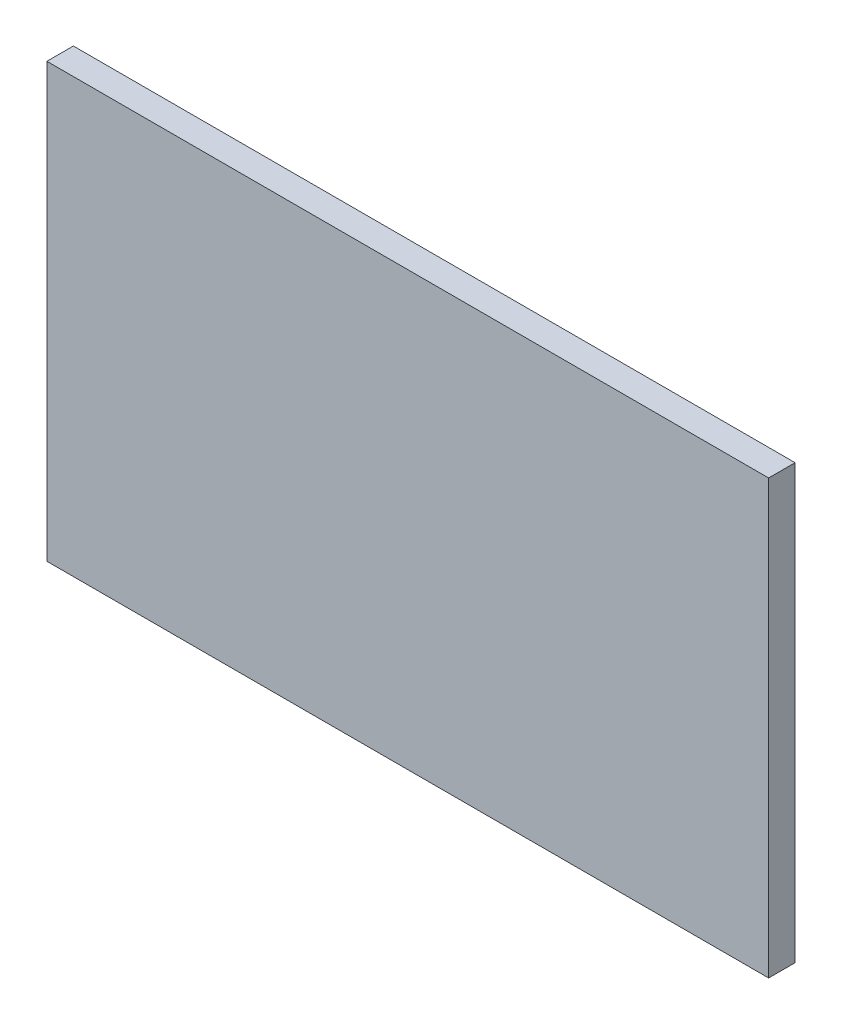
ISO-10303-21;
HEADER;
FILE_DESCRIPTION(('STEP AP214'),'2;1');
FILE_NAME('part.step','',(''),(''),'','','');
FILE_SCHEMA(('AUTOMOTIVE_DESIGN { 1 0 10303 214 1 1 1 1 }'));
ENDSEC;
DATA;
#1=APPLICATION_CONTEXT('core data for automotive mechanical design processes');
#2=APPLICATION_PROTOCOL_DEFINITION('international standard','automotive_design',2000,#1);
#3=PRODUCT_CONTEXT('',#1,'mechanical');
#4=PRODUCT('Part','Part','',(#3));
#5=PRODUCT_RELATED_PRODUCT_CATEGORY('part','',(#4));
#6=PRODUCT_DEFINITION_FORMATION('','',#4);
#7=PRODUCT_DEFINITION_CONTEXT('part definition',#1,'design');
#8=PRODUCT_DEFINITION('design','',#6,#7);
#9=PRODUCT_DEFINITION_SHAPE('','',#8);
#10=(LENGTH_UNIT() NAMED_UNIT(*) SI_UNIT(.MILLI.,.METRE.));
#11=(NAMED_UNIT(*) PLANE_ANGLE_UNIT() SI_UNIT($,.RADIAN.));
#12=(NAMED_UNIT(*) SI_UNIT($,.STERADIAN.) SOLID_ANGLE_UNIT());
#13=UNCERTAINTY_MEASURE_WITH_UNIT(LENGTH_MEASURE(1.E-05),#10,'distance_accuracy_value','');
#14=(GEOMETRIC_REPRESENTATION_CONTEXT(3) GLOBAL_UNCERTAINTY_ASSIGNED_CONTEXT((#13)) GLOBAL_UNIT_ASSIGNED_CONTEXT((#10,
#11,#12)) REPRESENTATION_CONTEXT('',''));
#15=CARTESIAN_POINT('',(0.,0.,0.));
#16=DIRECTION('',(0.,0.,1.));
#17=DIRECTION('',(1.,0.,0.));
#18=AXIS2_PLACEMENT_3D('',#15,#16,#17);
#19=CARTESIAN_POINT('',(0.,0.,0.));
#20=DIRECTION('',(1.,0.,0.));
#21=DIRECTION('',(0.,1.,0.));
#22=AXIS2_PLACEMENT_3D('',#19,#20,#21);
#23=PLANE('',#22);
#24=DIRECTION('',(0.,1.,0.));
#25=VECTOR('',#24,1.);
#26=CARTESIAN_POINT('',(0.,0.,0.055));
#27=LINE('',#26,#25);
#28=CARTESIAN_POINT('',(0.,0.,0.055));
#29=VERTEX_POINT('',#28);
#30=CARTESIAN_POINT('',(0.,0.9,0.055));
#31=VERTEX_POINT('',#30);
#32=EDGE_CURVE('E11',#29,#31,#27,.T.);
#33=ORIENTED_EDGE('',*,*,#32,.T.);
#34=DIRECTION('',(0.,0.,1.));
#35=VECTOR('',#34,1.);
#36=CARTESIAN_POINT('',(0.,0.9,0.));
#37=LINE('',#36,#35);
#38=CARTESIAN_POINT('',(0.,0.9,0.));
#39=VERTEX_POINT('',#38);
#40=EDGE_CURVE('E21',#39,#31,#37,.T.);
#41=ORIENTED_EDGE('',*,*,#40,.F.);
#42=DIRECTION('',(0.,1.,0.));
#43=VECTOR('',#42,1.);
#44=CARTESIAN_POINT('',(0.,0.,0.));
#45=LINE('',#44,#43);
#46=CARTESIAN_POINT('',(0.,0.,0.));
#47=VERTEX_POINT('',#46);
#48=EDGE_CURVE('E98',#47,#39,#45,.T.);
#49=ORIENTED_EDGE('',*,*,#48,.F.);
#50=DIRECTION('',(0.,0.,1.));
#51=VECTOR('',#50,1.);
#52=CARTESIAN_POINT('',(0.,0.,0.));
#53=LINE('',#52,#51);
#54=EDGE_CURVE('E28',#47,#29,#53,.T.);
#55=ORIENTED_EDGE('',*,*,#54,.T.);
#56=EDGE_LOOP('',(#33,#41,#49,#55));
#57=FACE_BOUND('',#56,.T.);
#58=ADVANCED_FACE('F17',(#57),#23,.F.);
#59=CARTESIAN_POINT('',(1.5,0.,0.));
#60=DIRECTION('',(1.,0.,0.));
#61=DIRECTION('',(0.,1.,0.));
#62=AXIS2_PLACEMENT_3D('',#59,#60,#61);
#63=PLANE('',#62);
#64=DIRECTION('',(0.,0.,1.));
#65=VECTOR('',#64,1.);
#66=CARTESIAN_POINT('',(1.5,0.,0.));
#67=LINE('',#66,#65);
#68=CARTESIAN_POINT('',(1.5,0.,0.));
#69=VERTEX_POINT('',#68);
#70=CARTESIAN_POINT('',(1.5,0.,0.055));
#71=VERTEX_POINT('',#70);
#72=EDGE_CURVE('E68',#69,#71,#67,.T.);
#73=ORIENTED_EDGE('',*,*,#72,.F.);
#74=DIRECTION('',(0.,1.,0.));
#75=VECTOR('',#74,1.);
#76=CARTESIAN_POINT('',(1.5,0.,0.));
#77=LINE('',#76,#75);
#78=CARTESIAN_POINT('',(1.5,0.9,0.));
#79=VERTEX_POINT('',#78);
#80=EDGE_CURVE('E71',#69,#79,#77,.T.);
#81=ORIENTED_EDGE('',*,*,#80,.T.);
#82=DIRECTION('',(0.,0.,1.));
#83=VECTOR('',#82,1.);
#84=CARTESIAN_POINT('',(1.5,0.9,0.));
#85=LINE('',#84,#83);
#86=CARTESIAN_POINT('',(1.5,0.9,0.055));
#87=VERTEX_POINT('',#86);
#88=EDGE_CURVE('E80',#79,#87,#85,.T.);
#89=ORIENTED_EDGE('',*,*,#88,.T.);
#90=DIRECTION('',(0.,1.,0.));
#91=VECTOR('',#90,1.);
#92=CARTESIAN_POINT('',(1.5,0.,0.055));
#93=LINE('',#92,#91);
#94=EDGE_CURVE('E74',#71,#87,#93,.T.);
#95=ORIENTED_EDGE('',*,*,#94,.F.);
#96=EDGE_LOOP('',(#73,#81,#89,#95));
#97=FACE_BOUND('',#96,.T.);
#98=ADVANCED_FACE('F19',(#97),#63,.T.);
#99=CARTESIAN_POINT('',(0.,0.,0.));
#100=DIRECTION('',(0.,1.,0.));
#101=DIRECTION('',(1.,0.,0.));
#102=AXIS2_PLACEMENT_3D('',#99,#100,#101);
#103=PLANE('',#102);
#104=ORIENTED_EDGE('',*,*,#72,.T.);
#105=DIRECTION('',(1.,0.,0.));
#106=VECTOR('',#105,1.);
#107=CARTESIAN_POINT('',(0.,0.,0.055));
#108=LINE('',#107,#106);
#109=EDGE_CURVE('E100',#29,#71,#108,.T.);
#110=ORIENTED_EDGE('',*,*,#109,.F.);
#111=ORIENTED_EDGE('',*,*,#54,.F.);
#112=DIRECTION('',(1.,0.,0.));
#113=VECTOR('',#112,1.);
#114=CARTESIAN_POINT('',(0.,0.,0.));
#115=LINE('',#114,#113);
#116=EDGE_CURVE('E81',#47,#69,#115,.T.);
#117=ORIENTED_EDGE('',*,*,#116,.T.);
#118=EDGE_LOOP('',(#104,#110,#111,#117));
#119=FACE_BOUND('',#118,.T.);
#120=ADVANCED_FACE('F90',(#119),#103,.F.);
#121=CARTESIAN_POINT('',(0.,0.9,0.));
#122=DIRECTION('',(0.,1.,0.));
#123=DIRECTION('',(1.,0.,0.));
#124=AXIS2_PLACEMENT_3D('',#121,#122,#123);
#125=PLANE('',#124);
#126=DIRECTION('',(1.,0.,0.));
#127=VECTOR('',#126,1.);
#128=CARTESIAN_POINT('',(0.,0.9,0.));
#129=LINE('',#128,#127);
#130=EDGE_CURVE('E86',#39,#79,#129,.T.);
#131=ORIENTED_EDGE('',*,*,#130,.F.);
#132=ORIENTED_EDGE('',*,*,#40,.T.);
#133=DIRECTION('',(1.,0.,0.));
#134=VECTOR('',#133,1.);
#135=CARTESIAN_POINT('',(0.,0.9,0.055));
#136=LINE('',#135,#134);
#137=EDGE_CURVE('E95',#31,#87,#136,.T.);
#138=ORIENTED_EDGE('',*,*,#137,.T.);
#139=ORIENTED_EDGE('',*,*,#88,.F.);
#140=EDGE_LOOP('',(#131,#132,#138,#139));
#141=FACE_BOUND('',#140,.T.);
#142=ADVANCED_FACE('F116',(#141),#125,.T.);
#143=CARTESIAN_POINT('',(0.,0.,0.));
#144=DIRECTION('',(0.,0.,1.));
#145=DIRECTION('',(1.,0.,0.));
#146=AXIS2_PLACEMENT_3D('',#143,#144,#145);
#147=PLANE('',#146);
#148=ORIENTED_EDGE('',*,*,#130,.T.);
#149=ORIENTED_EDGE('',*,*,#80,.F.);
#150=ORIENTED_EDGE('',*,*,#116,.F.);
#151=ORIENTED_EDGE('',*,*,#48,.T.);
#152=EDGE_LOOP('',(#148,#149,#150,#151));
#153=FACE_BOUND('',#152,.T.);
#154=ADVANCED_FACE('F85',(#153),#147,.F.);
#155=CARTESIAN_POINT('',(0.,0.,0.055));
#156=DIRECTION('',(0.,0.,1.));
#157=DIRECTION('',(1.,0.,0.));
#158=AXIS2_PLACEMENT_3D('',#155,#156,#157);
#159=PLANE('',#158);
#160=ORIENTED_EDGE('',*,*,#32,.F.);
#161=ORIENTED_EDGE('',*,*,#109,.T.);
#162=ORIENTED_EDGE('',*,*,#94,.T.);
#163=ORIENTED_EDGE('',*,*,#137,.F.);
#164=EDGE_LOOP('',(#160,#161,#162,#163));
#165=FACE_BOUND('',#164,.T.);
#166=ADVANCED_FACE('F115',(#165),#159,.T.);
#167=CLOSED_SHELL('',(#58,#98,#120,#142,#154,#166));
#168=MANIFOLD_SOLID_BREP('B1',#167);
#169=ADVANCED_BREP_SHAPE_REPRESENTATION('',(#18,#168),#14);
#170=SHAPE_DEFINITION_REPRESENTATION(#9,#169);
ENDSEC;
END-ISO-10303-21;
